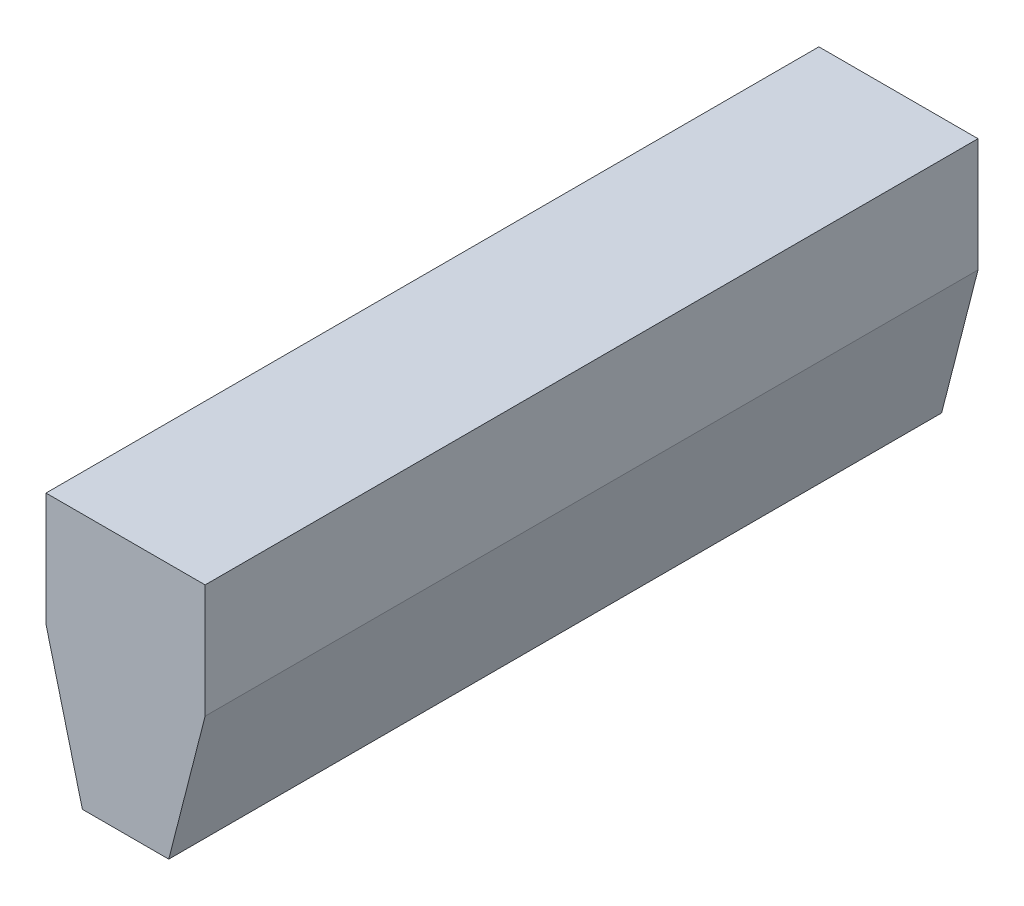
ISO-10303-21;
HEADER;
FILE_DESCRIPTION(('STEP AP214'),'2;1');
FILE_NAME('part.step','',(''),(''),'','','');
FILE_SCHEMA(('AUTOMOTIVE_DESIGN { 1 0 10303 214 1 1 1 1 }'));
ENDSEC;
DATA;
#1=APPLICATION_CONTEXT('core data for automotive mechanical design processes');
#2=APPLICATION_PROTOCOL_DEFINITION('international standard','automotive_design',2000,#1);
#3=PRODUCT_CONTEXT('',#1,'mechanical');
#4=PRODUCT('Part','Part','',(#3));
#5=PRODUCT_RELATED_PRODUCT_CATEGORY('part','',(#4));
#6=PRODUCT_DEFINITION_FORMATION('','',#4);
#7=PRODUCT_DEFINITION_CONTEXT('part definition',#1,'design');
#8=PRODUCT_DEFINITION('design','',#6,#7);
#9=PRODUCT_DEFINITION_SHAPE('','',#8);
#10=(LENGTH_UNIT() NAMED_UNIT(*) SI_UNIT(.MILLI.,.METRE.));
#11=(NAMED_UNIT(*) PLANE_ANGLE_UNIT() SI_UNIT($,.RADIAN.));
#12=(NAMED_UNIT(*) SI_UNIT($,.STERADIAN.) SOLID_ANGLE_UNIT());
#13=UNCERTAINTY_MEASURE_WITH_UNIT(LENGTH_MEASURE(1.E-05),#10,'distance_accuracy_value','');
#14=(GEOMETRIC_REPRESENTATION_CONTEXT(3) GLOBAL_UNCERTAINTY_ASSIGNED_CONTEXT((#13)) GLOBAL_UNIT_ASSIGNED_CONTEXT((#10,
#11,#12)) REPRESENTATION_CONTEXT('',''));
#15=CARTESIAN_POINT('',(0.,0.,0.));
#16=DIRECTION('',(0.,0.,1.));
#17=DIRECTION('',(1.,0.,0.));
#18=AXIS2_PLACEMENT_3D('',#15,#16,#17);
#19=CARTESIAN_POINT('',(-70.,155.,-700.));
#20=DIRECTION('',(-1.,0.,0.));
#21=DIRECTION('',(0.,0.,1.));
#22=AXIS2_PLACEMENT_3D('',#19,#20,#21);
#23=PLANE('',#22);
#24=DIRECTION('',(0.,-1.,0.));
#25=VECTOR('',#24,1.);
#26=CARTESIAN_POINT('',(-70.,155.,-20.));
#27=LINE('',#26,#25);
#28=CARTESIAN_POINT('',(-70.,255.,-20.));
#29=VERTEX_POINT('',#28);
#30=CARTESIAN_POINT('',(-70.,155.,-20.));
#31=VERTEX_POINT('',#30);
#32=EDGE_CURVE('E124',#29,#31,#27,.T.);
#33=ORIENTED_EDGE('',*,*,#32,.F.);
#34=DIRECTION('',(0.,0.,1.));
#35=VECTOR('',#34,1.);
#36=CARTESIAN_POINT('',(-70.,255.,-700.));
#37=LINE('',#36,#35);
#38=CARTESIAN_POINT('',(-70.,255.,-700.));
#39=VERTEX_POINT('',#38);
#40=EDGE_CURVE('E11',#39,#29,#37,.T.);
#41=ORIENTED_EDGE('',*,*,#40,.F.);
#42=DIRECTION('',(0.,-1.,0.));
#43=VECTOR('',#42,1.);
#44=CARTESIAN_POINT('',(-70.,155.,-700.));
#45=LINE('',#44,#43);
#46=CARTESIAN_POINT('',(-70.,155.,-700.));
#47=VERTEX_POINT('',#46);
#48=EDGE_CURVE('E138',#39,#47,#45,.T.);
#49=ORIENTED_EDGE('',*,*,#48,.T.);
#50=DIRECTION('',(0.,0.,1.));
#51=VECTOR('',#50,1.);
#52=CARTESIAN_POINT('',(-70.,155.,-700.));
#53=LINE('',#52,#51);
#54=EDGE_CURVE('E42',#47,#31,#53,.T.);
#55=ORIENTED_EDGE('',*,*,#54,.T.);
#56=EDGE_LOOP('',(#33,#41,#49,#55));
#57=FACE_BOUND('',#56,.T.);
#58=ADVANCED_FACE('F39',(#57),#23,.T.);
#59=CARTESIAN_POINT('',(-70.,255.,-700.));
#60=DIRECTION('',(0.,1.,0.));
#61=DIRECTION('',(0.,0.,1.));
#62=AXIS2_PLACEMENT_3D('',#59,#60,#61);
#63=PLANE('',#62);
#64=DIRECTION('',(-1.,0.,0.));
#65=VECTOR('',#64,1.);
#66=CARTESIAN_POINT('',(-70.,255.,-20.));
#67=LINE('',#66,#65);
#68=CARTESIAN_POINT('',(70.,255.,-20.));
#69=VERTEX_POINT('',#68);
#70=EDGE_CURVE('E136',#69,#29,#67,.T.);
#71=ORIENTED_EDGE('',*,*,#70,.F.);
#72=DIRECTION('',(0.,0.,1.));
#73=VECTOR('',#72,1.);
#74=CARTESIAN_POINT('',(70.,255.,-700.));
#75=LINE('',#74,#73);
#76=CARTESIAN_POINT('',(70.,255.,-700.));
#77=VERTEX_POINT('',#76);
#78=EDGE_CURVE('E48',#77,#69,#75,.T.);
#79=ORIENTED_EDGE('',*,*,#78,.F.);
#80=DIRECTION('',(-1.,0.,0.));
#81=VECTOR('',#80,1.);
#82=CARTESIAN_POINT('',(-70.,255.,-700.));
#83=LINE('',#82,#81);
#84=EDGE_CURVE('E114',#77,#39,#83,.T.);
#85=ORIENTED_EDGE('',*,*,#84,.T.);
#86=ORIENTED_EDGE('',*,*,#40,.T.);
#87=EDGE_LOOP('',(#71,#79,#85,#86));
#88=FACE_BOUND('',#87,.T.);
#89=ADVANCED_FACE('F146',(#88),#63,.T.);
#90=CARTESIAN_POINT('',(70.,255.,-700.));
#91=DIRECTION('',(1.,0.,0.));
#92=DIRECTION('',(0.,0.,-1.));
#93=AXIS2_PLACEMENT_3D('',#90,#91,#92);
#94=PLANE('',#93);
#95=DIRECTION('',(0.,1.,0.));
#96=VECTOR('',#95,1.);
#97=CARTESIAN_POINT('',(70.,255.,-20.));
#98=LINE('',#97,#96);
#99=CARTESIAN_POINT('',(70.,155.,-20.));
#100=VERTEX_POINT('',#99);
#101=EDGE_CURVE('E101',#100,#69,#98,.T.);
#102=ORIENTED_EDGE('',*,*,#101,.F.);
#103=DIRECTION('',(0.,0.,1.));
#104=VECTOR('',#103,1.);
#105=CARTESIAN_POINT('',(70.,155.,-700.));
#106=LINE('',#105,#104);
#107=CARTESIAN_POINT('',(70.,155.,-700.));
#108=VERTEX_POINT('',#107);
#109=EDGE_CURVE('E96',#108,#100,#106,.T.);
#110=ORIENTED_EDGE('',*,*,#109,.F.);
#111=DIRECTION('',(0.,1.,0.));
#112=VECTOR('',#111,1.);
#113=CARTESIAN_POINT('',(70.,255.,-700.));
#114=LINE('',#113,#112);
#115=EDGE_CURVE('E99',#108,#77,#114,.T.);
#116=ORIENTED_EDGE('',*,*,#115,.T.);
#117=ORIENTED_EDGE('',*,*,#78,.T.);
#118=EDGE_LOOP('',(#102,#110,#116,#117));
#119=FACE_BOUND('',#118,.T.);
#120=ADVANCED_FACE('F98',(#119),#94,.T.);
#121=CARTESIAN_POINT('',(70.,155.,-700.));
#122=DIRECTION('',(0.968759415176318,-0.248002410285138,0.));
#123=DIRECTION('',(0.248002410285138,0.968759415176318,0.));
#124=AXIS2_PLACEMENT_3D('',#121,#122,#123);
#125=PLANE('',#124);
#126=DIRECTION('',(0.248002410285138,0.968759415176318,0.));
#127=VECTOR('',#126,1.);
#128=CARTESIAN_POINT('',(70.,155.,-20.));
#129=LINE('',#128,#127);
#130=CARTESIAN_POINT('',(38.,30.,-20.));
#131=VERTEX_POINT('',#130);
#132=EDGE_CURVE('E133',#131,#100,#129,.T.);
#133=ORIENTED_EDGE('',*,*,#132,.F.);
#134=DIRECTION('',(0.,0.,1.));
#135=VECTOR('',#134,1.);
#136=CARTESIAN_POINT('',(38.,30.,-700.));
#137=LINE('',#136,#135);
#138=CARTESIAN_POINT('',(38.,30.,-700.));
#139=VERTEX_POINT('',#138);
#140=EDGE_CURVE('E106',#139,#131,#137,.T.);
#141=ORIENTED_EDGE('',*,*,#140,.F.);
#142=DIRECTION('',(0.248002410285138,0.968759415176318,0.));
#143=VECTOR('',#142,1.);
#144=CARTESIAN_POINT('',(70.,155.,-700.));
#145=LINE('',#144,#143);
#146=EDGE_CURVE('E112',#139,#108,#145,.T.);
#147=ORIENTED_EDGE('',*,*,#146,.T.);
#148=ORIENTED_EDGE('',*,*,#109,.T.);
#149=EDGE_LOOP('',(#133,#141,#147,#148));
#150=FACE_BOUND('',#149,.T.);
#151=ADVANCED_FACE('F116',(#150),#125,.T.);
#152=CARTESIAN_POINT('',(38.,30.,-700.));
#153=DIRECTION('',(0.,-1.,0.));
#154=DIRECTION('',(0.,0.,-1.));
#155=AXIS2_PLACEMENT_3D('',#152,#153,#154);
#156=PLANE('',#155);
#157=DIRECTION('',(1.,0.,0.));
#158=VECTOR('',#157,1.);
#159=CARTESIAN_POINT('',(38.,30.,-20.));
#160=LINE('',#159,#158);
#161=CARTESIAN_POINT('',(-38.,30.,-20.));
#162=VERTEX_POINT('',#161);
#163=EDGE_CURVE('E130',#162,#131,#160,.T.);
#164=ORIENTED_EDGE('',*,*,#163,.F.);
#165=DIRECTION('',(0.,0.,1.));
#166=VECTOR('',#165,1.);
#167=CARTESIAN_POINT('',(-38.,30.,-700.));
#168=LINE('',#167,#166);
#169=CARTESIAN_POINT('',(-38.,30.,-700.));
#170=VERTEX_POINT('',#169);
#171=EDGE_CURVE('E141',#170,#162,#168,.T.);
#172=ORIENTED_EDGE('',*,*,#171,.F.);
#173=DIRECTION('',(1.,0.,0.));
#174=VECTOR('',#173,1.);
#175=CARTESIAN_POINT('',(38.,30.,-700.));
#176=LINE('',#175,#174);
#177=EDGE_CURVE('E117',#170,#139,#176,.T.);
#178=ORIENTED_EDGE('',*,*,#177,.T.);
#179=ORIENTED_EDGE('',*,*,#140,.T.);
#180=EDGE_LOOP('',(#164,#172,#178,#179));
#181=FACE_BOUND('',#180,.T.);
#182=ADVANCED_FACE('F159',(#181),#156,.T.);
#183=CARTESIAN_POINT('',(-38.,30.,-700.));
#184=DIRECTION('',(-0.968759415176318,-0.248002410285138,0.));
#185=DIRECTION('',(0.248002410285138,-0.968759415176318,0.));
#186=AXIS2_PLACEMENT_3D('',#183,#184,#185);
#187=PLANE('',#186);
#188=DIRECTION('',(0.248002410285138,-0.968759415176318,0.));
#189=VECTOR('',#188,1.);
#190=CARTESIAN_POINT('',(-38.,30.,-20.));
#191=LINE('',#190,#189);
#192=EDGE_CURVE('E127',#31,#162,#191,.T.);
#193=ORIENTED_EDGE('',*,*,#192,.F.);
#194=ORIENTED_EDGE('',*,*,#54,.F.);
#195=DIRECTION('',(0.248002410285138,-0.968759415176318,0.));
#196=VECTOR('',#195,1.);
#197=CARTESIAN_POINT('',(-38.,30.,-700.));
#198=LINE('',#197,#196);
#199=EDGE_CURVE('E119',#47,#170,#198,.T.);
#200=ORIENTED_EDGE('',*,*,#199,.T.);
#201=ORIENTED_EDGE('',*,*,#171,.T.);
#202=EDGE_LOOP('',(#193,#194,#200,#201));
#203=FACE_BOUND('',#202,.T.);
#204=ADVANCED_FACE('F143',(#203),#187,.T.);
#205=CARTESIAN_POINT('',(0.,0.,-700.));
#206=DIRECTION('',(0.,0.,-1.));
#207=DIRECTION('',(-1.,0.,0.));
#208=AXIS2_PLACEMENT_3D('',#205,#206,#207);
#209=PLANE('',#208);
#210=ORIENTED_EDGE('',*,*,#48,.F.);
#211=ORIENTED_EDGE('',*,*,#84,.F.);
#212=ORIENTED_EDGE('',*,*,#115,.F.);
#213=ORIENTED_EDGE('',*,*,#146,.F.);
#214=ORIENTED_EDGE('',*,*,#177,.F.);
#215=ORIENTED_EDGE('',*,*,#199,.F.);
#216=EDGE_LOOP('',(#210,#211,#212,#213,#214,#215));
#217=FACE_BOUND('',#216,.T.);
#218=ADVANCED_FACE('F110',(#217),#209,.T.);
#219=CARTESIAN_POINT('',(0.,0.,-20.));
#220=DIRECTION('',(0.,0.,-1.));
#221=DIRECTION('',(-1.,0.,0.));
#222=AXIS2_PLACEMENT_3D('',#219,#220,#221);
#223=PLANE('',#222);
#224=ORIENTED_EDGE('',*,*,#32,.T.);
#225=ORIENTED_EDGE('',*,*,#192,.T.);
#226=ORIENTED_EDGE('',*,*,#163,.T.);
#227=ORIENTED_EDGE('',*,*,#132,.T.);
#228=ORIENTED_EDGE('',*,*,#101,.T.);
#229=ORIENTED_EDGE('',*,*,#70,.T.);
#230=EDGE_LOOP('',(#224,#225,#226,#227,#228,#229));
#231=FACE_BOUND('',#230,.T.);
#232=ADVANCED_FACE('F145',(#231),#223,.F.);
#233=CLOSED_SHELL('',(#58,#89,#120,#151,#182,#204,#218,#232));
#234=MANIFOLD_SOLID_BREP('B2',#233);
#235=ADVANCED_BREP_SHAPE_REPRESENTATION('',(#18,#234),#14);
#236=SHAPE_DEFINITION_REPRESENTATION(#9,#235);
ENDSEC;
END-ISO-10303-21;
